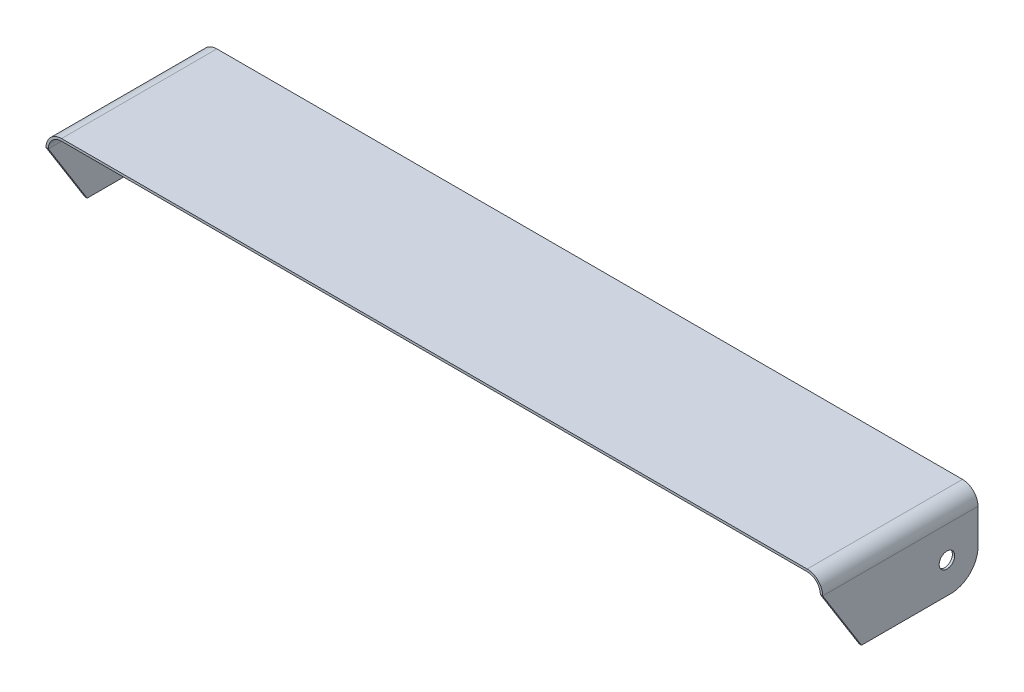
ISO-10303-21;
HEADER;
FILE_DESCRIPTION(('STEP AP214'),'2;1');
FILE_NAME('part.step','',(''),(''),'','','');
FILE_SCHEMA(('AUTOMOTIVE_DESIGN { 1 0 10303 214 1 1 1 1 }'));
ENDSEC;
DATA;
#1=APPLICATION_CONTEXT('core data for automotive mechanical design processes');
#2=APPLICATION_PROTOCOL_DEFINITION('international standard','automotive_design',2000,#1);
#3=PRODUCT_CONTEXT('',#1,'mechanical');
#4=PRODUCT('Part','Part','',(#3));
#5=PRODUCT_RELATED_PRODUCT_CATEGORY('part','',(#4));
#6=PRODUCT_DEFINITION_FORMATION('','',#4);
#7=PRODUCT_DEFINITION_CONTEXT('part definition',#1,'design');
#8=PRODUCT_DEFINITION('design','',#6,#7);
#9=PRODUCT_DEFINITION_SHAPE('','',#8);
#10=(LENGTH_UNIT() NAMED_UNIT(*) SI_UNIT(.MILLI.,.METRE.));
#11=(NAMED_UNIT(*) PLANE_ANGLE_UNIT() SI_UNIT($,.RADIAN.));
#12=(NAMED_UNIT(*) SI_UNIT($,.STERADIAN.) SOLID_ANGLE_UNIT());
#13=UNCERTAINTY_MEASURE_WITH_UNIT(LENGTH_MEASURE(1.E-05),#10,'distance_accuracy_value','');
#14=(GEOMETRIC_REPRESENTATION_CONTEXT(3) GLOBAL_UNCERTAINTY_ASSIGNED_CONTEXT((#13)) GLOBAL_UNIT_ASSIGNED_CONTEXT((#10,
#11,#12)) REPRESENTATION_CONTEXT('',''));
#15=CARTESIAN_POINT('',(0.,0.,0.));
#16=DIRECTION('',(0.,0.,1.));
#17=DIRECTION('',(1.,0.,0.));
#18=AXIS2_PLACEMENT_3D('',#15,#16,#17);
#19=CARTESIAN_POINT('',(-500.,0.,100.));
#20=DIRECTION('',(0.,1.,0.));
#21=DIRECTION('',(0.,0.,1.));
#22=AXIS2_PLACEMENT_3D('',#19,#20,#21);
#23=PLANE('',#22);
#24=DIRECTION('',(0.,0.,-1.));
#25=VECTOR('',#24,1.);
#26=CARTESIAN_POINT('',(-500.,0.,100.));
#27=LINE('',#26,#25);
#28=CARTESIAN_POINT('',(-500.,0.,50.));
#29=VERTEX_POINT('',#28);
#30=CARTESIAN_POINT('',(-500.,0.,-65.));
#31=VERTEX_POINT('',#30);
#32=EDGE_CURVE('E160',#29,#31,#27,.T.);
#33=ORIENTED_EDGE('',*,*,#32,.T.);
#34=DIRECTION('',(1.,0.,0.));
#35=VECTOR('',#34,1.);
#36=CARTESIAN_POINT('',(-497.,0.,-65.));
#37=LINE('',#36,#35);
#38=CARTESIAN_POINT('',(-497.,0.,-65.));
#39=VERTEX_POINT('',#38);
#40=EDGE_CURVE('E210',#31,#39,#37,.T.);
#41=ORIENTED_EDGE('',*,*,#40,.T.);
#42=DIRECTION('',(0.,0.,-1.));
#43=VECTOR('',#42,1.);
#44=CARTESIAN_POINT('',(-497.,0.,100.));
#45=LINE('',#44,#43);
#46=CARTESIAN_POINT('',(-497.,0.,50.));
#47=VERTEX_POINT('',#46);
#48=EDGE_CURVE('E204',#47,#39,#45,.T.);
#49=ORIENTED_EDGE('',*,*,#48,.F.);
#50=DIRECTION('',(1.,0.,0.));
#51=VECTOR('',#50,1.);
#52=CARTESIAN_POINT('',(-500.,0.,50.));
#53=LINE('',#52,#51);
#54=EDGE_CURVE('E247',#29,#47,#53,.T.);
#55=ORIENTED_EDGE('',*,*,#54,.F.);
#56=EDGE_LOOP('',(#33,#41,#49,#55));
#57=FACE_BOUND('',#56,.T.);
#58=ADVANCED_FACE('F39',(#57),#23,.F.);
#59=CARTESIAN_POINT('',(-497.,0.,100.));
#60=DIRECTION('',(-1.,0.,0.));
#61=DIRECTION('',(0.,0.,1.));
#62=AXIS2_PLACEMENT_3D('',#59,#60,#61);
#63=PLANE('',#62);
#64=CARTESIAN_POINT('',(-497.,40.,-60.));
#65=DIRECTION('',(-1.,0.,0.));
#66=DIRECTION('',(0.,0.,1.));
#67=AXIS2_PLACEMENT_3D('',#64,#65,#66);
#68=CIRCLE('',#67,10.);
#69=CARTESIAN_POINT('',(-497.,40.,-50.));
#70=VERTEX_POINT('',#69);
#71=EDGE_CURVE('E323',#70,#70,#68,.T.);
#72=ORIENTED_EDGE('',*,*,#71,.T.);
#73=EDGE_LOOP('',(#72));
#74=FACE_BOUND('',#73,.T.);
#75=ORIENTED_EDGE('',*,*,#48,.T.);
#76=CARTESIAN_POINT('',(-497.,35.,-65.));
#77=DIRECTION('',(-1.,0.,0.));
#78=DIRECTION('',(0.,0.,1.));
#79=AXIS2_PLACEMENT_3D('',#76,#77,#78);
#80=CIRCLE('',#79,35.);
#81=CARTESIAN_POINT('',(-497.,35.,-100.));
#82=VERTEX_POINT('',#81);
#83=EDGE_CURVE('E213',#39,#82,#80,.F.);
#84=ORIENTED_EDGE('',*,*,#83,.T.);
#85=DIRECTION('',(0.,1.,0.));
#86=VECTOR('',#85,1.);
#87=CARTESIAN_POINT('',(-497.,0.,-100.));
#88=LINE('',#87,#86);
#89=CARTESIAN_POINT('',(-497.,79.9999999999999,-100.));
#90=VERTEX_POINT('',#89);
#91=EDGE_CURVE('E282',#82,#90,#88,.T.);
#92=ORIENTED_EDGE('',*,*,#91,.T.);
#93=DIRECTION('',(0.,0.,-1.));
#94=VECTOR('',#93,1.);
#95=CARTESIAN_POINT('',(-497.,79.9999999999999,100.));
#96=LINE('',#95,#94);
#97=CARTESIAN_POINT('',(-497.,79.9999999999999,100.));
#98=VERTEX_POINT('',#97);
#99=EDGE_CURVE('E201',#98,#90,#96,.T.);
#100=ORIENTED_EDGE('',*,*,#99,.F.);
#101=DIRECTION('',(0.,-0.847998304005088,-0.529998940003181));
#102=VECTOR('',#101,1.);
#103=CARTESIAN_POINT('',(-497.,22.4719101123596,64.0449438202248));
#104=LINE('',#103,#102);
#105=EDGE_CURVE('E145',#98,#47,#104,.T.);
#106=ORIENTED_EDGE('',*,*,#105,.T.);
#107=EDGE_LOOP('',(#75,#84,#92,#100,#106));
#108=FACE_BOUND('',#107,.T.);
#109=ADVANCED_FACE('F296',(#74,#108),#63,.F.);
#110=CARTESIAN_POINT('',(-480.,80.,100.));
#111=DIRECTION('',(0.,0.,-1.));
#112=DIRECTION('',(-1.,0.,0.));
#113=AXIS2_PLACEMENT_3D('',#110,#111,#112);
#114=CYLINDRICAL_SURFACE('',#113,17.);
#115=CARTESIAN_POINT('',(-480.,80.,-100.));
#116=DIRECTION('',(0.,0.,-1.));
#117=DIRECTION('',(-1.,0.,0.));
#118=AXIS2_PLACEMENT_3D('',#115,#116,#117);
#119=CIRCLE('',#118,17.);
#120=CARTESIAN_POINT('',(-480.,97.,-100.));
#121=VERTEX_POINT('',#120);
#122=EDGE_CURVE('E264',#90,#121,#119,.T.);
#123=ORIENTED_EDGE('',*,*,#122,.T.);
#124=DIRECTION('',(0.,0.,-1.));
#125=VECTOR('',#124,1.);
#126=CARTESIAN_POINT('',(-480.,97.,100.));
#127=LINE('',#126,#125);
#128=CARTESIAN_POINT('',(-480.,97.,100.));
#129=VERTEX_POINT('',#128);
#130=EDGE_CURVE('E198',#129,#121,#127,.T.);
#131=ORIENTED_EDGE('',*,*,#130,.F.);
#132=CARTESIAN_POINT('',(-480.,80.,100.));
#133=DIRECTION('',(0.,0.,-1.));
#134=DIRECTION('',(-1.,0.,0.));
#135=AXIS2_PLACEMENT_3D('',#132,#133,#134);
#136=CIRCLE('',#135,17.);
#137=EDGE_CURVE('E272',#98,#129,#136,.T.);
#138=ORIENTED_EDGE('',*,*,#137,.F.);
#139=ORIENTED_EDGE('',*,*,#99,.T.);
#140=EDGE_LOOP('',(#123,#131,#138,#139));
#141=FACE_BOUND('',#140,.T.);
#142=ADVANCED_FACE('F285',(#141),#114,.F.);
#143=CARTESIAN_POINT('',(-480.,97.,100.));
#144=DIRECTION('',(0.,1.,0.));
#145=DIRECTION('',(-1.,0.,0.));
#146=AXIS2_PLACEMENT_3D('',#143,#144,#145);
#147=PLANE('',#146);
#148=DIRECTION('',(1.,0.,0.));
#149=VECTOR('',#148,1.);
#150=CARTESIAN_POINT('',(-480.,97.,-100.));
#151=LINE('',#150,#149);
#152=CARTESIAN_POINT('',(480.,97.,-100.));
#153=VERTEX_POINT('',#152);
#154=EDGE_CURVE('E261',#121,#153,#151,.T.);
#155=ORIENTED_EDGE('',*,*,#154,.T.);
#156=DIRECTION('',(0.,0.,-1.));
#157=VECTOR('',#156,1.);
#158=CARTESIAN_POINT('',(480.,97.,100.));
#159=LINE('',#158,#157);
#160=CARTESIAN_POINT('',(480.,97.,100.));
#161=VERTEX_POINT('',#160);
#162=EDGE_CURVE('E195',#161,#153,#159,.T.);
#163=ORIENTED_EDGE('',*,*,#162,.F.);
#164=DIRECTION('',(1.,0.,0.));
#165=VECTOR('',#164,1.);
#166=CARTESIAN_POINT('',(-480.,97.,100.));
#167=LINE('',#166,#165);
#168=EDGE_CURVE('E252',#129,#161,#167,.T.);
#169=ORIENTED_EDGE('',*,*,#168,.F.);
#170=ORIENTED_EDGE('',*,*,#130,.T.);
#171=EDGE_LOOP('',(#155,#163,#169,#170));
#172=FACE_BOUND('',#171,.T.);
#173=ADVANCED_FACE('F287',(#172),#147,.F.);
#174=CARTESIAN_POINT('',(480.,80.,100.));
#175=DIRECTION('',(0.,0.,-1.));
#176=DIRECTION('',(-1.,0.,0.));
#177=AXIS2_PLACEMENT_3D('',#174,#175,#176);
#178=CYLINDRICAL_SURFACE('',#177,17.);
#179=CARTESIAN_POINT('',(480.,80.,-100.));
#180=DIRECTION('',(0.,0.,-1.));
#181=DIRECTION('',(-1.,0.,0.));
#182=AXIS2_PLACEMENT_3D('',#179,#180,#181);
#183=CIRCLE('',#182,17.);
#184=CARTESIAN_POINT('',(497.,79.9999999999999,-100.));
#185=VERTEX_POINT('',#184);
#186=EDGE_CURVE('E259',#153,#185,#183,.T.);
#187=ORIENTED_EDGE('',*,*,#186,.T.);
#188=DIRECTION('',(0.,0.,-1.));
#189=VECTOR('',#188,1.);
#190=CARTESIAN_POINT('',(497.,79.9999999999999,100.));
#191=LINE('',#190,#189);
#192=CARTESIAN_POINT('',(497.,79.9999999999999,100.));
#193=VERTEX_POINT('',#192);
#194=EDGE_CURVE('E192',#193,#185,#191,.T.);
#195=ORIENTED_EDGE('',*,*,#194,.F.);
#196=CARTESIAN_POINT('',(480.,80.,100.));
#197=DIRECTION('',(0.,0.,-1.));
#198=DIRECTION('',(-1.,0.,0.));
#199=AXIS2_PLACEMENT_3D('',#196,#197,#198);
#200=CIRCLE('',#199,17.);
#201=EDGE_CURVE('E250',#161,#193,#200,.T.);
#202=ORIENTED_EDGE('',*,*,#201,.F.);
#203=ORIENTED_EDGE('',*,*,#162,.T.);
#204=EDGE_LOOP('',(#187,#195,#202,#203));
#205=FACE_BOUND('',#204,.T.);
#206=ADVANCED_FACE('F257',(#205),#178,.F.);
#207=CARTESIAN_POINT('',(497.,79.9999999999999,100.));
#208=DIRECTION('',(1.,0.,0.));
#209=DIRECTION('',(0.,0.,-1.));
#210=AXIS2_PLACEMENT_3D('',#207,#208,#209);
#211=PLANE('',#210);
#212=CARTESIAN_POINT('',(497.,40.,-60.));
#213=DIRECTION('',(1.,0.,0.));
#214=DIRECTION('',(0.,0.,-1.));
#215=AXIS2_PLACEMENT_3D('',#212,#213,#214);
#216=CIRCLE('',#215,10.);
#217=CARTESIAN_POINT('',(497.,40.,-70.));
#218=VERTEX_POINT('',#217);
#219=EDGE_CURVE('E327',#218,#218,#216,.T.);
#220=ORIENTED_EDGE('',*,*,#219,.T.);
#221=EDGE_LOOP('',(#220));
#222=FACE_BOUND('',#221,.T.);
#223=DIRECTION('',(0.,-1.,0.));
#224=VECTOR('',#223,1.);
#225=CARTESIAN_POINT('',(497.,79.9999999999999,-100.));
#226=LINE('',#225,#224);
#227=CARTESIAN_POINT('',(497.,35.,-100.));
#228=VERTEX_POINT('',#227);
#229=EDGE_CURVE('E236',#185,#228,#226,.T.);
#230=ORIENTED_EDGE('',*,*,#229,.T.);
#231=CARTESIAN_POINT('',(497.,35.,-65.));
#232=DIRECTION('',(1.,0.,0.));
#233=DIRECTION('',(0.,0.,-1.));
#234=AXIS2_PLACEMENT_3D('',#231,#232,#233);
#235=CIRCLE('',#234,35.);
#236=CARTESIAN_POINT('',(497.,0.,-65.));
#237=VERTEX_POINT('',#236);
#238=EDGE_CURVE('E11',#228,#237,#235,.F.);
#239=ORIENTED_EDGE('',*,*,#238,.T.);
#240=DIRECTION('',(0.,0.,-1.));
#241=VECTOR('',#240,1.);
#242=CARTESIAN_POINT('',(497.,0.,100.));
#243=LINE('',#242,#241);
#244=CARTESIAN_POINT('',(497.,0.,50.));
#245=VERTEX_POINT('',#244);
#246=EDGE_CURVE('E190',#245,#237,#243,.T.);
#247=ORIENTED_EDGE('',*,*,#246,.F.);
#248=DIRECTION('',(0.,0.847998304005088,0.529998940003181));
#249=VECTOR('',#248,1.);
#250=CARTESIAN_POINT('',(497.,79.9999999999999,100.));
#251=LINE('',#250,#249);
#252=EDGE_CURVE('E243',#245,#193,#251,.T.);
#253=ORIENTED_EDGE('',*,*,#252,.T.);
#254=ORIENTED_EDGE('',*,*,#194,.T.);
#255=EDGE_LOOP('',(#230,#239,#247,#253,#254));
#256=FACE_BOUND('',#255,.T.);
#257=ADVANCED_FACE('F242',(#222,#256),#211,.F.);
#258=CARTESIAN_POINT('',(497.,0.,100.));
#259=DIRECTION('',(0.,1.,0.));
#260=DIRECTION('',(0.,0.,1.));
#261=AXIS2_PLACEMENT_3D('',#258,#259,#260);
#262=PLANE('',#261);
#263=ORIENTED_EDGE('',*,*,#246,.T.);
#264=DIRECTION('',(1.,0.,0.));
#265=VECTOR('',#264,1.);
#266=CARTESIAN_POINT('',(500.,0.,-65.));
#267=LINE('',#266,#265);
#268=CARTESIAN_POINT('',(500.,0.,-65.));
#269=VERTEX_POINT('',#268);
#270=EDGE_CURVE('E221',#237,#269,#267,.T.);
#271=ORIENTED_EDGE('',*,*,#270,.T.);
#272=DIRECTION('',(0.,0.,-1.));
#273=VECTOR('',#272,1.);
#274=CARTESIAN_POINT('',(500.,0.,100.));
#275=LINE('',#274,#273);
#276=CARTESIAN_POINT('',(500.,0.,50.));
#277=VERTEX_POINT('',#276);
#278=EDGE_CURVE('E187',#277,#269,#275,.T.);
#279=ORIENTED_EDGE('',*,*,#278,.F.);
#280=EDGE_CURVE('E149',#245,#277,#53,.T.);
#281=ORIENTED_EDGE('',*,*,#280,.F.);
#282=EDGE_LOOP('',(#263,#271,#279,#281));
#283=FACE_BOUND('',#282,.T.);
#284=ADVANCED_FACE('F239',(#283),#262,.F.);
#285=CARTESIAN_POINT('',(500.,79.9999999999999,100.));
#286=DIRECTION('',(-1.,0.,0.));
#287=DIRECTION('',(0.,0.,1.));
#288=AXIS2_PLACEMENT_3D('',#285,#286,#287);
#289=PLANE('',#288);
#290=CARTESIAN_POINT('',(500.,40.,-60.));
#291=DIRECTION('',(1.,0.,0.));
#292=DIRECTION('',(0.,0.,-1.));
#293=AXIS2_PLACEMENT_3D('',#290,#291,#292);
#294=CIRCLE('',#293,10.);
#295=CARTESIAN_POINT('',(500.,40.,-70.));
#296=VERTEX_POINT('',#295);
#297=EDGE_CURVE('E331',#296,#296,#294,.T.);
#298=ORIENTED_EDGE('',*,*,#297,.F.);
#299=EDGE_LOOP('',(#298));
#300=FACE_BOUND('',#299,.T.);
#301=ORIENTED_EDGE('',*,*,#278,.T.);
#302=CARTESIAN_POINT('',(500.,35.,-65.));
#303=DIRECTION('',(-1.,0.,0.));
#304=DIRECTION('',(0.,0.,1.));
#305=AXIS2_PLACEMENT_3D('',#302,#303,#304);
#306=CIRCLE('',#305,35.);
#307=CARTESIAN_POINT('',(500.,35.,-100.));
#308=VERTEX_POINT('',#307);
#309=EDGE_CURVE('E47',#269,#308,#306,.F.);
#310=ORIENTED_EDGE('',*,*,#309,.T.);
#311=DIRECTION('',(0.,1.,0.));
#312=VECTOR('',#311,1.);
#313=CARTESIAN_POINT('',(500.,79.9999999999999,-100.));
#314=LINE('',#313,#312);
#315=CARTESIAN_POINT('',(500.,79.9999999999999,-100.));
#316=VERTEX_POINT('',#315);
#317=EDGE_CURVE('E226',#308,#316,#314,.T.);
#318=ORIENTED_EDGE('',*,*,#317,.T.);
#319=DIRECTION('',(0.,0.,-1.));
#320=VECTOR('',#319,1.);
#321=CARTESIAN_POINT('',(500.,79.9999999999999,100.));
#322=LINE('',#321,#320);
#323=CARTESIAN_POINT('',(500.,79.9999999999999,100.));
#324=VERTEX_POINT('',#323);
#325=EDGE_CURVE('E184',#324,#316,#322,.T.);
#326=ORIENTED_EDGE('',*,*,#325,.F.);
#327=DIRECTION('',(0.,0.847998304005088,0.529998940003181));
#328=VECTOR('',#327,1.);
#329=CARTESIAN_POINT('',(500.,0.,50.));
#330=LINE('',#329,#328);
#331=EDGE_CURVE('E161',#277,#324,#330,.T.);
#332=ORIENTED_EDGE('',*,*,#331,.F.);
#333=EDGE_LOOP('',(#301,#310,#318,#326,#332));
#334=FACE_BOUND('',#333,.T.);
#335=ADVANCED_FACE('F224',(#300,#334),#289,.F.);
#336=CARTESIAN_POINT('',(480.,80.,100.));
#337=DIRECTION('',(0.,0.,-1.));
#338=DIRECTION('',(-1.,0.,0.));
#339=AXIS2_PLACEMENT_3D('',#336,#337,#338);
#340=CYLINDRICAL_SURFACE('',#339,20.);
#341=CARTESIAN_POINT('',(480.,80.,-100.));
#342=DIRECTION('',(0.,0.,1.));
#343=DIRECTION('',(-1.,0.,0.));
#344=AXIS2_PLACEMENT_3D('',#341,#342,#343);
#345=CIRCLE('',#344,20.);
#346=CARTESIAN_POINT('',(480.,100.,-100.));
#347=VERTEX_POINT('',#346);
#348=EDGE_CURVE('E235',#316,#347,#345,.T.);
#349=ORIENTED_EDGE('',*,*,#348,.T.);
#350=DIRECTION('',(0.,0.,-1.));
#351=VECTOR('',#350,1.);
#352=CARTESIAN_POINT('',(480.,100.,100.));
#353=LINE('',#352,#351);
#354=CARTESIAN_POINT('',(480.,100.,100.));
#355=VERTEX_POINT('',#354);
#356=EDGE_CURVE('E177',#355,#347,#353,.T.);
#357=ORIENTED_EDGE('',*,*,#356,.F.);
#358=CARTESIAN_POINT('',(480.,80.,100.));
#359=DIRECTION('',(0.,0.,1.));
#360=DIRECTION('',(-1.,0.,0.));
#361=AXIS2_PLACEMENT_3D('',#358,#359,#360);
#362=CIRCLE('',#361,20.);
#363=EDGE_CURVE('E255',#324,#355,#362,.T.);
#364=ORIENTED_EDGE('',*,*,#363,.F.);
#365=ORIENTED_EDGE('',*,*,#325,.T.);
#366=EDGE_LOOP('',(#349,#357,#364,#365));
#367=FACE_BOUND('',#366,.T.);
#368=ADVANCED_FACE('F347',(#367),#340,.T.);
#369=CARTESIAN_POINT('',(-480.,100.,100.));
#370=DIRECTION('',(0.,-1.,0.));
#371=DIRECTION('',(0.,0.,-1.));
#372=AXIS2_PLACEMENT_3D('',#369,#370,#371);
#373=PLANE('',#372);
#374=DIRECTION('',(-1.,0.,0.));
#375=VECTOR('',#374,1.);
#376=CARTESIAN_POINT('',(-480.,100.,-100.));
#377=LINE('',#376,#375);
#378=CARTESIAN_POINT('',(-480.,100.,-100.));
#379=VERTEX_POINT('',#378);
#380=EDGE_CURVE('E269',#347,#379,#377,.T.);
#381=ORIENTED_EDGE('',*,*,#380,.T.);
#382=DIRECTION('',(0.,0.,-1.));
#383=VECTOR('',#382,1.);
#384=CARTESIAN_POINT('',(-480.,100.,100.));
#385=LINE('',#384,#383);
#386=CARTESIAN_POINT('',(-480.,100.,100.));
#387=VERTEX_POINT('',#386);
#388=EDGE_CURVE('E175',#387,#379,#385,.T.);
#389=ORIENTED_EDGE('',*,*,#388,.F.);
#390=DIRECTION('',(-1.,0.,0.));
#391=VECTOR('',#390,1.);
#392=CARTESIAN_POINT('',(-480.,100.,100.));
#393=LINE('',#392,#391);
#394=EDGE_CURVE('E167',#355,#387,#393,.T.);
#395=ORIENTED_EDGE('',*,*,#394,.F.);
#396=ORIENTED_EDGE('',*,*,#356,.T.);
#397=EDGE_LOOP('',(#381,#389,#395,#396));
#398=FACE_BOUND('',#397,.T.);
#399=ADVANCED_FACE('F343',(#398),#373,.F.);
#400=CARTESIAN_POINT('',(-480.,80.,100.));
#401=DIRECTION('',(0.,0.,-1.));
#402=DIRECTION('',(-1.,0.,0.));
#403=AXIS2_PLACEMENT_3D('',#400,#401,#402);
#404=CYLINDRICAL_SURFACE('',#403,20.);
#405=CARTESIAN_POINT('',(-480.,80.,-100.));
#406=DIRECTION('',(0.,0.,1.));
#407=DIRECTION('',(-1.,0.,0.));
#408=AXIS2_PLACEMENT_3D('',#405,#406,#407);
#409=CIRCLE('',#408,20.);
#410=CARTESIAN_POINT('',(-500.,79.9999999999999,-100.));
#411=VERTEX_POINT('',#410);
#412=EDGE_CURVE('E174',#379,#411,#409,.T.);
#413=ORIENTED_EDGE('',*,*,#412,.T.);
#414=DIRECTION('',(0.,0.,-1.));
#415=VECTOR('',#414,1.);
#416=CARTESIAN_POINT('',(-500.,79.9999999999999,100.));
#417=LINE('',#416,#415);
#418=CARTESIAN_POINT('',(-500.,79.9999999999999,100.));
#419=VERTEX_POINT('',#418);
#420=EDGE_CURVE('E157',#419,#411,#417,.T.);
#421=ORIENTED_EDGE('',*,*,#420,.F.);
#422=CARTESIAN_POINT('',(-480.,80.,100.));
#423=DIRECTION('',(0.,0.,1.));
#424=DIRECTION('',(-1.,0.,0.));
#425=AXIS2_PLACEMENT_3D('',#422,#423,#424);
#426=CIRCLE('',#425,20.);
#427=EDGE_CURVE('E164',#387,#419,#426,.T.);
#428=ORIENTED_EDGE('',*,*,#427,.F.);
#429=ORIENTED_EDGE('',*,*,#388,.T.);
#430=EDGE_LOOP('',(#413,#421,#428,#429));
#431=FACE_BOUND('',#430,.T.);
#432=ADVANCED_FACE('F172',(#431),#404,.T.);
#433=CARTESIAN_POINT('',(-500.,0.,100.));
#434=DIRECTION('',(1.,0.,0.));
#435=DIRECTION('',(0.,0.,-1.));
#436=AXIS2_PLACEMENT_3D('',#433,#434,#435);
#437=PLANE('',#436);
#438=CARTESIAN_POINT('',(-500.,40.,-60.));
#439=DIRECTION('',(1.,0.,0.));
#440=DIRECTION('',(0.,0.,-1.));
#441=AXIS2_PLACEMENT_3D('',#438,#439,#440);
#442=CIRCLE('',#441,10.);
#443=CARTESIAN_POINT('',(-500.,40.,-70.));
#444=VERTEX_POINT('',#443);
#445=EDGE_CURVE('E330',#444,#444,#442,.T.);
#446=ORIENTED_EDGE('',*,*,#445,.T.);
#447=EDGE_LOOP('',(#446));
#448=FACE_BOUND('',#447,.T.);
#449=DIRECTION('',(0.,-1.,0.));
#450=VECTOR('',#449,1.);
#451=CARTESIAN_POINT('',(-500.,0.,-100.));
#452=LINE('',#451,#450);
#453=CARTESIAN_POINT('',(-500.,35.,-100.));
#454=VERTEX_POINT('',#453);
#455=EDGE_CURVE('E271',#411,#454,#452,.T.);
#456=ORIENTED_EDGE('',*,*,#455,.T.);
#457=CARTESIAN_POINT('',(-500.,35.,-65.));
#458=DIRECTION('',(1.,0.,0.));
#459=DIRECTION('',(0.,0.,-1.));
#460=AXIS2_PLACEMENT_3D('',#457,#458,#459);
#461=CIRCLE('',#460,35.);
#462=EDGE_CURVE('E219',#454,#31,#461,.F.);
#463=ORIENTED_EDGE('',*,*,#462,.T.);
#464=ORIENTED_EDGE('',*,*,#32,.F.);
#465=DIRECTION('',(0.,0.847998304005088,0.529998940003181));
#466=VECTOR('',#465,1.);
#467=CARTESIAN_POINT('',(-500.,0.,50.));
#468=LINE('',#467,#466);
#469=EDGE_CURVE('E142',#29,#419,#468,.T.);
#470=ORIENTED_EDGE('',*,*,#469,.T.);
#471=ORIENTED_EDGE('',*,*,#420,.T.);
#472=EDGE_LOOP('',(#456,#463,#464,#470,#471));
#473=FACE_BOUND('',#472,.T.);
#474=ADVANCED_FACE('F155',(#448,#473),#437,.F.);
#475=CARTESIAN_POINT('',(-480.,80.,100.));
#476=DIRECTION('',(0.,0.,-1.));
#477=DIRECTION('',(-1.,0.,0.));
#478=AXIS2_PLACEMENT_3D('',#475,#476,#477);
#479=PLANE('',#478);
#480=ORIENTED_EDGE('',*,*,#427,.T.);
#481=DIRECTION('',(1.,0.,0.));
#482=VECTOR('',#481,1.);
#483=CARTESIAN_POINT('',(-500.,79.9999999999999,100.));
#484=LINE('',#483,#482);
#485=EDGE_CURVE('E139',#419,#98,#484,.T.);
#486=ORIENTED_EDGE('',*,*,#485,.T.);
#487=ORIENTED_EDGE('',*,*,#137,.T.);
#488=ORIENTED_EDGE('',*,*,#168,.T.);
#489=ORIENTED_EDGE('',*,*,#201,.T.);
#490=DIRECTION('',(1.,0.,0.));
#491=VECTOR('',#490,1.);
#492=CARTESIAN_POINT('',(-480.,79.9999999999999,100.));
#493=LINE('',#492,#491);
#494=EDGE_CURVE('E207',#193,#324,#493,.T.);
#495=ORIENTED_EDGE('',*,*,#494,.T.);
#496=ORIENTED_EDGE('',*,*,#363,.T.);
#497=ORIENTED_EDGE('',*,*,#394,.T.);
#498=EDGE_LOOP('',(#480,#486,#487,#488,#489,#495,#496,#497));
#499=FACE_BOUND('',#498,.T.);
#500=ADVANCED_FACE('F165',(#499),#479,.F.);
#501=CARTESIAN_POINT('',(-480.,80.,-100.));
#502=DIRECTION('',(0.,0.,-1.));
#503=DIRECTION('',(-1.,0.,0.));
#504=AXIS2_PLACEMENT_3D('',#501,#502,#503);
#505=PLANE('',#504);
#506=ORIENTED_EDGE('',*,*,#91,.F.);
#507=DIRECTION('',(1.,0.,0.));
#508=VECTOR('',#507,1.);
#509=CARTESIAN_POINT('',(-500.,35.,-100.));
#510=LINE('',#509,#508);
#511=EDGE_CURVE('E217',#82,#454,#510,.F.);
#512=ORIENTED_EDGE('',*,*,#511,.T.);
#513=ORIENTED_EDGE('',*,*,#455,.F.);
#514=ORIENTED_EDGE('',*,*,#412,.F.);
#515=ORIENTED_EDGE('',*,*,#380,.F.);
#516=ORIENTED_EDGE('',*,*,#348,.F.);
#517=ORIENTED_EDGE('',*,*,#317,.F.);
#518=DIRECTION('',(1.,0.,0.));
#519=VECTOR('',#518,1.);
#520=CARTESIAN_POINT('',(497.,35.,-100.));
#521=LINE('',#520,#519);
#522=EDGE_CURVE('E215',#308,#228,#521,.F.);
#523=ORIENTED_EDGE('',*,*,#522,.T.);
#524=ORIENTED_EDGE('',*,*,#229,.F.);
#525=ORIENTED_EDGE('',*,*,#186,.F.);
#526=ORIENTED_EDGE('',*,*,#154,.F.);
#527=ORIENTED_EDGE('',*,*,#122,.F.);
#528=EDGE_LOOP('',(#506,#512,#513,#514,#515,#516,#517,#523,#524,#525,#526,#527));
#529=FACE_BOUND('',#528,.T.);
#530=ADVANCED_FACE('F232',(#529),#505,.T.);
#531=CARTESIAN_POINT('',(-500.,0.,50.));
#532=DIRECTION('',(0.,0.529998940003181,-0.847998304005088));
#533=DIRECTION('',(0.,0.847998304005088,0.529998940003181));
#534=AXIS2_PLACEMENT_3D('',#531,#532,#533);
#535=PLANE('',#534);
#536=ORIENTED_EDGE('',*,*,#280,.T.);
#537=ORIENTED_EDGE('',*,*,#331,.T.);
#538=ORIENTED_EDGE('',*,*,#494,.F.);
#539=ORIENTED_EDGE('',*,*,#252,.F.);
#540=EDGE_LOOP('',(#536,#537,#538,#539));
#541=FACE_BOUND('',#540,.T.);
#542=ADVANCED_FACE('F348',(#541),#535,.F.);
#543=ORIENTED_EDGE('',*,*,#485,.F.);
#544=ORIENTED_EDGE('',*,*,#469,.F.);
#545=ORIENTED_EDGE('',*,*,#54,.T.);
#546=ORIENTED_EDGE('',*,*,#105,.F.);
#547=EDGE_LOOP('',(#543,#544,#545,#546));
#548=FACE_BOUND('',#547,.T.);
#549=ADVANCED_FACE('F141',(#548),#535,.F.);
#550=CARTESIAN_POINT('',(-500.,40.,-60.));
#551=DIRECTION('',(1.,0.,0.));
#552=DIRECTION('',(0.,0.,-1.));
#553=AXIS2_PLACEMENT_3D('',#550,#551,#552);
#554=CYLINDRICAL_SURFACE('',#553,10.);
#555=ORIENTED_EDGE('',*,*,#445,.F.);
#556=EDGE_LOOP('',(#555));
#557=FACE_BOUND('',#556,.T.);
#558=ORIENTED_EDGE('',*,*,#71,.F.);
#559=EDGE_LOOP('',(#558));
#560=FACE_BOUND('',#559,.T.);
#561=ADVANCED_FACE('F315',(#557,#560),#554,.F.);
#562=ORIENTED_EDGE('',*,*,#297,.T.);
#563=EDGE_LOOP('',(#562));
#564=FACE_BOUND('',#563,.T.);
#565=ORIENTED_EDGE('',*,*,#219,.F.);
#566=EDGE_LOOP('',(#565));
#567=FACE_BOUND('',#566,.T.);
#568=ADVANCED_FACE('F309',(#564,#567),#554,.F.);
#569=CARTESIAN_POINT('',(-500.,35.,-65.));
#570=DIRECTION('',(-1.,0.,0.));
#571=DIRECTION('',(0.,0.,1.));
#572=AXIS2_PLACEMENT_3D('',#569,#570,#571);
#573=CYLINDRICAL_SURFACE('',#572,35.);
#574=ORIENTED_EDGE('',*,*,#462,.F.);
#575=ORIENTED_EDGE('',*,*,#511,.F.);
#576=ORIENTED_EDGE('',*,*,#83,.F.);
#577=ORIENTED_EDGE('',*,*,#40,.F.);
#578=EDGE_LOOP('',(#574,#575,#576,#577));
#579=FACE_BOUND('',#578,.T.);
#580=ADVANCED_FACE('F307',(#579),#573,.T.);
#581=CARTESIAN_POINT('',(497.,35.,-65.));
#582=DIRECTION('',(-1.,0.,0.));
#583=DIRECTION('',(0.,0.,1.));
#584=AXIS2_PLACEMENT_3D('',#581,#582,#583);
#585=CYLINDRICAL_SURFACE('',#584,35.);
#586=ORIENTED_EDGE('',*,*,#238,.F.);
#587=ORIENTED_EDGE('',*,*,#522,.F.);
#588=ORIENTED_EDGE('',*,*,#309,.F.);
#589=ORIENTED_EDGE('',*,*,#270,.F.);
#590=EDGE_LOOP('',(#586,#587,#588,#589));
#591=FACE_BOUND('',#590,.T.);
#592=ADVANCED_FACE('F41',(#591),#585,.T.);
#593=CLOSED_SHELL('',(#58,#109,#142,#173,#206,#257,#284,#335,#368,#399,#432,#474,#500,#530,#542,
#549,#561,#568,#580,#592));
#594=MANIFOLD_SOLID_BREP('B2',#593);
#595=ADVANCED_BREP_SHAPE_REPRESENTATION('',(#18,#594),#14);
#596=SHAPE_DEFINITION_REPRESENTATION(#9,#595);
ENDSEC;
END-ISO-10303-21;
